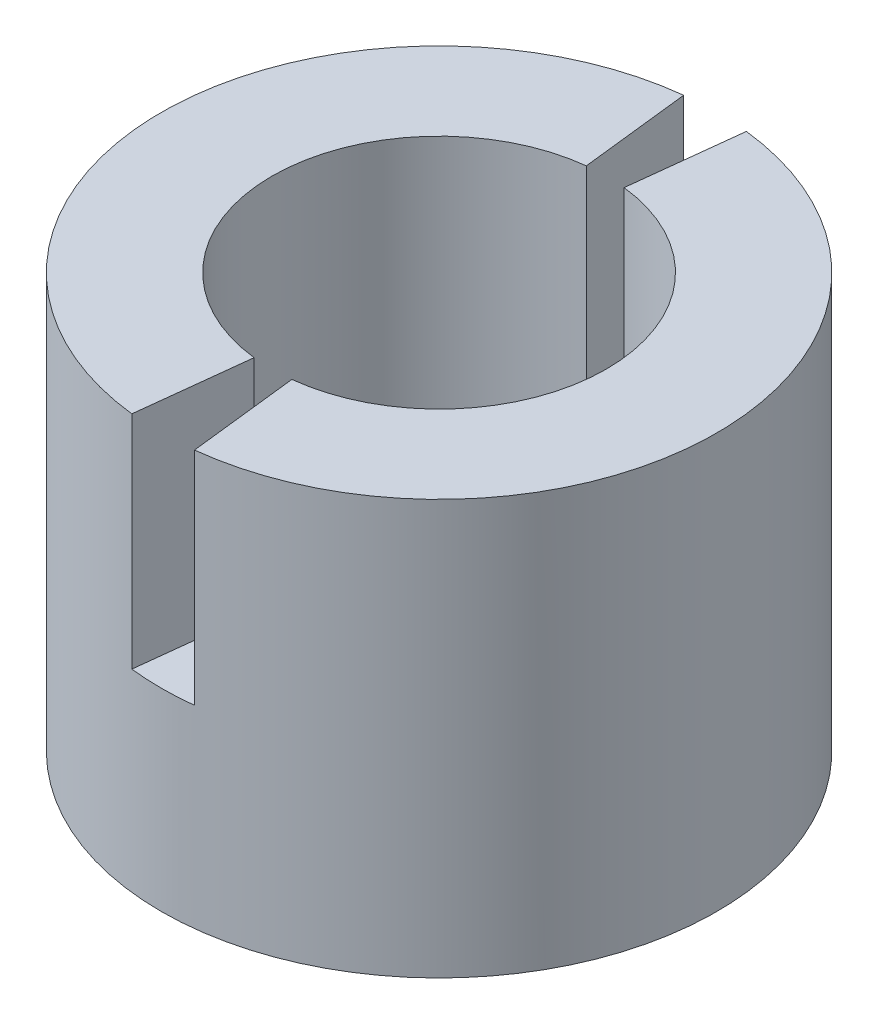
ISO-10303-21;
HEADER;
FILE_DESCRIPTION(('STEP AP214'),'2;1');
FILE_NAME('part.step','',(''),(''),'','','');
FILE_SCHEMA(('AUTOMOTIVE_DESIGN { 1 0 10303 214 1 1 1 1 }'));
ENDSEC;
DATA;
#1=APPLICATION_CONTEXT('core data for automotive mechanical design processes');
#2=APPLICATION_PROTOCOL_DEFINITION('international standard','automotive_design',2000,#1);
#3=PRODUCT_CONTEXT('',#1,'mechanical');
#4=PRODUCT('Part','Part','',(#3));
#5=PRODUCT_RELATED_PRODUCT_CATEGORY('part','',(#4));
#6=PRODUCT_DEFINITION_FORMATION('','',#4);
#7=PRODUCT_DEFINITION_CONTEXT('part definition',#1,'design');
#8=PRODUCT_DEFINITION('design','',#6,#7);
#9=PRODUCT_DEFINITION_SHAPE('','',#8);
#10=(LENGTH_UNIT() NAMED_UNIT(*) SI_UNIT(.MILLI.,.METRE.));
#11=(NAMED_UNIT(*) PLANE_ANGLE_UNIT() SI_UNIT($,.RADIAN.));
#12=(NAMED_UNIT(*) SI_UNIT($,.STERADIAN.) SOLID_ANGLE_UNIT());
#13=UNCERTAINTY_MEASURE_WITH_UNIT(LENGTH_MEASURE(1.E-05),#10,'distance_accuracy_value','');
#14=(GEOMETRIC_REPRESENTATION_CONTEXT(3) GLOBAL_UNCERTAINTY_ASSIGNED_CONTEXT((#13)) GLOBAL_UNIT_ASSIGNED_CONTEXT((#10,
#11,#12)) REPRESENTATION_CONTEXT('',''));
#15=CARTESIAN_POINT('',(0.,0.,0.));
#16=DIRECTION('',(0.,0.,1.));
#17=DIRECTION('',(1.,0.,0.));
#18=AXIS2_PLACEMENT_3D('',#15,#16,#17);
#19=CARTESIAN_POINT('',(0.,15.,0.));
#20=DIRECTION('',(0.,1.,0.));
#21=DIRECTION('',(0.,0.,1.));
#22=AXIS2_PLACEMENT_3D('',#19,#20,#21);
#23=PLANE('',#22);
#24=DIRECTION('',(0.112854640488553,0.,-0.99361150864923));
#25=VECTOR('',#24,1.);
#26=CARTESIAN_POINT('',(0.637272671467664,15.,-5.61077025966101));
#27=LINE('',#26,#25);
#28=CARTESIAN_POINT('',(0.682770574955748,15.,-6.01134962732784));
#29=VERTEX_POINT('',#28);
#30=CARTESIAN_POINT('',(1.13418913690996,15.,-9.98579566192476));
#31=VERTEX_POINT('',#30);
#32=EDGE_CURVE('E183',#29,#31,#27,.T.);
#33=ORIENTED_EDGE('',*,*,#32,.F.);
#34=CARTESIAN_POINT('',(0.,15.,0.));
#35=DIRECTION('',(0.,1.,0.));
#36=DIRECTION('',(0.,0.,1.));
#37=AXIS2_PLACEMENT_3D('',#34,#35,#36);
#38=CIRCLE('',#37,6.05);
#39=CARTESIAN_POINT('',(0.682770574955748,15.,6.01134962732784));
#40=VERTEX_POINT('',#39);
#41=EDGE_CURVE('E137',#40,#29,#38,.T.);
#42=ORIENTED_EDGE('',*,*,#41,.F.);
#43=DIRECTION('',(-0.112854640488553,0.,-0.99361150864923));
#44=VECTOR('',#43,1.);
#45=CARTESIAN_POINT('',(0.637272671467664,15.,5.61077025966101));
#46=LINE('',#45,#44);
#47=CARTESIAN_POINT('',(1.13418913690996,15.,9.98579566192476));
#48=VERTEX_POINT('',#47);
#49=EDGE_CURVE('E129',#48,#40,#46,.T.);
#50=ORIENTED_EDGE('',*,*,#49,.F.);
#51=CARTESIAN_POINT('',(0.,15.,0.));
#52=DIRECTION('',(0.,1.,0.));
#53=DIRECTION('',(0.,0.,1.));
#54=AXIS2_PLACEMENT_3D('',#51,#52,#53);
#55=CIRCLE('',#54,10.05);
#56=EDGE_CURVE('E150',#48,#31,#55,.T.);
#57=ORIENTED_EDGE('',*,*,#56,.T.);
#58=EDGE_LOOP('',(#33,#42,#50,#57));
#59=FACE_BOUND('',#58,.T.);
#60=ADVANCED_FACE('F41',(#59),#23,.T.);
#61=DIRECTION('',(0.112854640488553,0.,0.99361150864923));
#62=VECTOR('',#61,1.);
#63=CARTESIAN_POINT('',(-0.637272671467664,15.,-5.61077025966101));
#64=LINE('',#63,#62);
#65=CARTESIAN_POINT('',(-1.13418913690996,15.,-9.98579566192476));
#66=VERTEX_POINT('',#65);
#67=CARTESIAN_POINT('',(-0.682770574955748,15.,-6.01134962732784));
#68=VERTEX_POINT('',#67);
#69=EDGE_CURVE('E167',#66,#68,#64,.T.);
#70=ORIENTED_EDGE('',*,*,#69,.F.);
#71=CARTESIAN_POINT('',(-1.13418913690996,15.,9.98579566192476));
#72=VERTEX_POINT('',#71);
#73=EDGE_CURVE('E127',#66,#72,#55,.T.);
#74=ORIENTED_EDGE('',*,*,#73,.T.);
#75=DIRECTION('',(-0.112854640488553,0.,0.99361150864923));
#76=VECTOR('',#75,1.);
#77=CARTESIAN_POINT('',(-0.637272671467664,15.,5.61077025966101));
#78=LINE('',#77,#76);
#79=CARTESIAN_POINT('',(-0.682770574955748,15.,6.01134962732784));
#80=VERTEX_POINT('',#79);
#81=EDGE_CURVE('E109',#80,#72,#78,.T.);
#82=ORIENTED_EDGE('',*,*,#81,.F.);
#83=EDGE_CURVE('E125',#68,#80,#38,.T.);
#84=ORIENTED_EDGE('',*,*,#83,.F.);
#85=EDGE_LOOP('',(#70,#74,#82,#84));
#86=FACE_BOUND('',#85,.T.);
#87=ADVANCED_FACE('F124',(#86),#23,.T.);
#88=CARTESIAN_POINT('',(0.,0.,0.));
#89=DIRECTION('',(0.,1.,0.));
#90=DIRECTION('',(0.,0.,1.));
#91=AXIS2_PLACEMENT_3D('',#88,#89,#90);
#92=PLANE('',#91);
#93=CARTESIAN_POINT('',(0.,0.,0.));
#94=DIRECTION('',(0.,1.,0.));
#95=DIRECTION('',(0.,0.,1.));
#96=AXIS2_PLACEMENT_3D('',#93,#94,#95);
#97=CIRCLE('',#96,10.05);
#98=CARTESIAN_POINT('',(0.,0.,10.05));
#99=VERTEX_POINT('',#98);
#100=EDGE_CURVE('E143',#99,#99,#97,.T.);
#101=ORIENTED_EDGE('',*,*,#100,.F.);
#102=EDGE_LOOP('',(#101));
#103=FACE_BOUND('',#102,.T.);
#104=CARTESIAN_POINT('',(0.,0.,0.));
#105=DIRECTION('',(0.,1.,0.));
#106=DIRECTION('',(0.,0.,1.));
#107=AXIS2_PLACEMENT_3D('',#104,#105,#106);
#108=CIRCLE('',#107,6.05);
#109=CARTESIAN_POINT('',(0.,0.,6.05));
#110=VERTEX_POINT('',#109);
#111=EDGE_CURVE('E138',#110,#110,#108,.T.);
#112=ORIENTED_EDGE('',*,*,#111,.T.);
#113=EDGE_LOOP('',(#112));
#114=FACE_BOUND('',#113,.T.);
#115=ADVANCED_FACE('F234',(#103,#114),#92,.F.);
#116=CARTESIAN_POINT('',(0.,15.,0.));
#117=DIRECTION('',(0.,-1.,0.));
#118=DIRECTION('',(0.,0.,-1.));
#119=AXIS2_PLACEMENT_3D('',#116,#117,#118);
#120=CYLINDRICAL_SURFACE('',#119,10.05);
#121=CARTESIAN_POINT('',(0.,7.,0.));
#122=DIRECTION('',(0.,1.,0.));
#123=DIRECTION('',(0.,0.,1.));
#124=AXIS2_PLACEMENT_3D('',#121,#122,#123);
#125=CIRCLE('',#124,10.05);
#126=CARTESIAN_POINT('',(1.13418913690996,7.,-9.98579566192476));
#127=VERTEX_POINT('',#126);
#128=CARTESIAN_POINT('',(-1.13418913690996,7.,-9.98579566192476));
#129=VERTEX_POINT('',#128);
#130=EDGE_CURVE('E204',#127,#129,#125,.T.);
#131=ORIENTED_EDGE('',*,*,#130,.F.);
#132=DIRECTION('',(0.,-1.,0.));
#133=VECTOR('',#132,1.);
#134=CARTESIAN_POINT('',(1.13418913690996,15.,-9.98579566192476));
#135=LINE('',#134,#133);
#136=EDGE_CURVE('E145',#127,#31,#135,.F.);
#137=ORIENTED_EDGE('',*,*,#136,.T.);
#138=ORIENTED_EDGE('',*,*,#56,.F.);
#139=DIRECTION('',(0.,-1.,0.));
#140=VECTOR('',#139,1.);
#141=CARTESIAN_POINT('',(1.13418913690996,15.,9.98579566192476));
#142=LINE('',#141,#140);
#143=CARTESIAN_POINT('',(1.13418913690996,7.,9.98579566192476));
#144=VERTEX_POINT('',#143);
#145=EDGE_CURVE('E200',#48,#144,#142,.T.);
#146=ORIENTED_EDGE('',*,*,#145,.T.);
#147=CARTESIAN_POINT('',(0.,7.,0.));
#148=DIRECTION('',(0.,-1.,0.));
#149=DIRECTION('',(0.,0.,-1.));
#150=AXIS2_PLACEMENT_3D('',#147,#148,#149);
#151=CIRCLE('',#150,10.05);
#152=CARTESIAN_POINT('',(-1.13418913690996,7.,9.98579566192476));
#153=VERTEX_POINT('',#152);
#154=EDGE_CURVE('E181',#144,#153,#151,.T.);
#155=ORIENTED_EDGE('',*,*,#154,.T.);
#156=DIRECTION('',(0.,-1.,0.));
#157=VECTOR('',#156,1.);
#158=CARTESIAN_POINT('',(-1.13418913690996,15.,9.98579566192476));
#159=LINE('',#158,#157);
#160=EDGE_CURVE('E197',#153,#72,#159,.F.);
#161=ORIENTED_EDGE('',*,*,#160,.T.);
#162=ORIENTED_EDGE('',*,*,#73,.F.);
#163=DIRECTION('',(0.,-1.,0.));
#164=VECTOR('',#163,1.);
#165=CARTESIAN_POINT('',(-1.13418913690996,15.,-9.98579566192476));
#166=LINE('',#165,#164);
#167=EDGE_CURVE('E206',#66,#129,#166,.T.);
#168=ORIENTED_EDGE('',*,*,#167,.T.);
#169=EDGE_LOOP('',(#131,#137,#138,#146,#155,#161,#162,#168));
#170=FACE_BOUND('',#169,.T.);
#171=ORIENTED_EDGE('',*,*,#100,.T.);
#172=EDGE_LOOP('',(#171));
#173=FACE_BOUND('',#172,.T.);
#174=ADVANCED_FACE('F43',(#170,#173),#120,.T.);
#175=CARTESIAN_POINT('',(0.,15.,0.));
#176=DIRECTION('',(0.,-1.,0.));
#177=DIRECTION('',(0.,0.,-1.));
#178=AXIS2_PLACEMENT_3D('',#175,#176,#177);
#179=CYLINDRICAL_SURFACE('',#178,6.05);
#180=DIRECTION('',(0.,-1.,0.));
#181=VECTOR('',#180,1.);
#182=CARTESIAN_POINT('',(0.682770574955748,15.,-6.01134962732784));
#183=LINE('',#182,#181);
#184=CARTESIAN_POINT('',(0.682770574955748,7.,-6.01134962732784));
#185=VERTEX_POINT('',#184);
#186=EDGE_CURVE('E11',#185,#29,#183,.F.);
#187=ORIENTED_EDGE('',*,*,#186,.F.);
#188=CARTESIAN_POINT('',(0.,7.,0.));
#189=DIRECTION('',(0.,1.,0.));
#190=DIRECTION('',(0.,0.,1.));
#191=AXIS2_PLACEMENT_3D('',#188,#189,#190);
#192=CIRCLE('',#191,6.05);
#193=CARTESIAN_POINT('',(-0.682770574955748,7.,-6.01134962732784));
#194=VERTEX_POINT('',#193);
#195=EDGE_CURVE('E161',#185,#194,#192,.T.);
#196=ORIENTED_EDGE('',*,*,#195,.T.);
#197=DIRECTION('',(0.,-1.,0.));
#198=VECTOR('',#197,1.);
#199=CARTESIAN_POINT('',(-0.682770574955748,15.,-6.01134962732784));
#200=LINE('',#199,#198);
#201=EDGE_CURVE('E50',#68,#194,#200,.T.);
#202=ORIENTED_EDGE('',*,*,#201,.F.);
#203=ORIENTED_EDGE('',*,*,#83,.T.);
#204=DIRECTION('',(0.,-1.,0.));
#205=VECTOR('',#204,1.);
#206=CARTESIAN_POINT('',(-0.682770574955748,15.,6.01134962732784));
#207=LINE('',#206,#205);
#208=CARTESIAN_POINT('',(-0.682770574955748,7.,6.01134962732784));
#209=VERTEX_POINT('',#208);
#210=EDGE_CURVE('E106',#209,#80,#207,.F.);
#211=ORIENTED_EDGE('',*,*,#210,.F.);
#212=CARTESIAN_POINT('',(0.,7.,0.));
#213=DIRECTION('',(0.,-1.,0.));
#214=DIRECTION('',(0.,0.,-1.));
#215=AXIS2_PLACEMENT_3D('',#212,#213,#214);
#216=CIRCLE('',#215,6.05);
#217=CARTESIAN_POINT('',(0.682770574955748,7.,6.01134962732784));
#218=VERTEX_POINT('',#217);
#219=EDGE_CURVE('E118',#218,#209,#216,.T.);
#220=ORIENTED_EDGE('',*,*,#219,.F.);
#221=DIRECTION('',(0.,-1.,0.));
#222=VECTOR('',#221,1.);
#223=CARTESIAN_POINT('',(0.682770574955748,15.,6.01134962732784));
#224=LINE('',#223,#222);
#225=EDGE_CURVE('E117',#40,#218,#224,.T.);
#226=ORIENTED_EDGE('',*,*,#225,.F.);
#227=ORIENTED_EDGE('',*,*,#41,.T.);
#228=EDGE_LOOP('',(#187,#196,#202,#203,#211,#220,#226,#227));
#229=FACE_BOUND('',#228,.T.);
#230=ORIENTED_EDGE('',*,*,#111,.F.);
#231=EDGE_LOOP('',(#230));
#232=FACE_BOUND('',#231,.T.);
#233=ADVANCED_FACE('F133',(#229,#232),#179,.F.);
#234=CARTESIAN_POINT('',(0.637272671467664,7.,5.61077025966101));
#235=DIRECTION('',(0.99361150864923,0.,-0.112854640488553));
#236=DIRECTION('',(-0.112854640488553,0.,-0.99361150864923));
#237=AXIS2_PLACEMENT_3D('',#234,#235,#236);
#238=PLANE('',#237);
#239=ORIENTED_EDGE('',*,*,#49,.T.);
#240=ORIENTED_EDGE('',*,*,#225,.T.);
#241=DIRECTION('',(-0.112854640488553,0.,-0.99361150864923));
#242=VECTOR('',#241,1.);
#243=CARTESIAN_POINT('',(0.637272671467664,7.,5.61077025966101));
#244=LINE('',#243,#242);
#245=EDGE_CURVE('E65',#144,#218,#244,.T.);
#246=ORIENTED_EDGE('',*,*,#245,.F.);
#247=ORIENTED_EDGE('',*,*,#145,.F.);
#248=EDGE_LOOP('',(#239,#240,#246,#247));
#249=FACE_BOUND('',#248,.T.);
#250=ADVANCED_FACE('F217',(#249),#238,.F.);
#251=CARTESIAN_POINT('',(-0.637272671467664,7.,5.61077025966101));
#252=DIRECTION('',(-0.99361150864923,0.,-0.112854640488553));
#253=DIRECTION('',(-0.112854640488553,0.,0.99361150864923));
#254=AXIS2_PLACEMENT_3D('',#251,#252,#253);
#255=PLANE('',#254);
#256=DIRECTION('',(-0.112854640488553,0.,0.99361150864923));
#257=VECTOR('',#256,1.);
#258=CARTESIAN_POINT('',(-0.637272671467664,7.,5.61077025966101));
#259=LINE('',#258,#257);
#260=EDGE_CURVE('E112',#209,#153,#259,.T.);
#261=ORIENTED_EDGE('',*,*,#260,.F.);
#262=ORIENTED_EDGE('',*,*,#210,.T.);
#263=ORIENTED_EDGE('',*,*,#81,.T.);
#264=ORIENTED_EDGE('',*,*,#160,.F.);
#265=EDGE_LOOP('',(#261,#262,#263,#264));
#266=FACE_BOUND('',#265,.T.);
#267=ADVANCED_FACE('F108',(#266),#255,.F.);
#268=CARTESIAN_POINT('',(0.,7.,0.));
#269=DIRECTION('',(0.,-1.,0.));
#270=DIRECTION('',(0.,0.,-1.));
#271=AXIS2_PLACEMENT_3D('',#268,#269,#270);
#272=PLANE('',#271);
#273=ORIENTED_EDGE('',*,*,#245,.T.);
#274=ORIENTED_EDGE('',*,*,#219,.T.);
#275=ORIENTED_EDGE('',*,*,#260,.T.);
#276=ORIENTED_EDGE('',*,*,#154,.F.);
#277=EDGE_LOOP('',(#273,#274,#275,#276));
#278=FACE_BOUND('',#277,.T.);
#279=ADVANCED_FACE('F218',(#278),#272,.F.);
#280=CARTESIAN_POINT('',(0.637272671467664,7.,-5.61077025966101));
#281=DIRECTION('',(0.99361150864923,0.,0.112854640488553));
#282=DIRECTION('',(0.112854640488553,0.,-0.99361150864923));
#283=AXIS2_PLACEMENT_3D('',#280,#281,#282);
#284=PLANE('',#283);
#285=DIRECTION('',(0.112854640488553,0.,-0.99361150864923));
#286=VECTOR('',#285,1.);
#287=CARTESIAN_POINT('',(0.637272671467664,7.,-5.61077025966101));
#288=LINE('',#287,#286);
#289=EDGE_CURVE('E171',#185,#127,#288,.T.);
#290=ORIENTED_EDGE('',*,*,#289,.F.);
#291=ORIENTED_EDGE('',*,*,#186,.T.);
#292=ORIENTED_EDGE('',*,*,#32,.T.);
#293=ORIENTED_EDGE('',*,*,#136,.F.);
#294=EDGE_LOOP('',(#290,#291,#292,#293));
#295=FACE_BOUND('',#294,.T.);
#296=ADVANCED_FACE('F174',(#295),#284,.F.);
#297=CARTESIAN_POINT('',(-0.637272671467664,7.,-5.61077025966101));
#298=DIRECTION('',(-0.99361150864923,0.,0.112854640488553));
#299=DIRECTION('',(0.112854640488553,0.,0.99361150864923));
#300=AXIS2_PLACEMENT_3D('',#297,#298,#299);
#301=PLANE('',#300);
#302=ORIENTED_EDGE('',*,*,#69,.T.);
#303=ORIENTED_EDGE('',*,*,#201,.T.);
#304=DIRECTION('',(0.112854640488553,0.,0.99361150864923));
#305=VECTOR('',#304,1.);
#306=CARTESIAN_POINT('',(-0.637272671467664,7.,-5.61077025966101));
#307=LINE('',#306,#305);
#308=EDGE_CURVE('E57',#129,#194,#307,.T.);
#309=ORIENTED_EDGE('',*,*,#308,.F.);
#310=ORIENTED_EDGE('',*,*,#167,.F.);
#311=EDGE_LOOP('',(#302,#303,#309,#310));
#312=FACE_BOUND('',#311,.T.);
#313=ADVANCED_FACE('F165',(#312),#301,.F.);
#314=CARTESIAN_POINT('',(0.,7.,0.));
#315=DIRECTION('',(0.,1.,0.));
#316=DIRECTION('',(0.,0.,1.));
#317=AXIS2_PLACEMENT_3D('',#314,#315,#316);
#318=PLANE('',#317);
#319=ORIENTED_EDGE('',*,*,#130,.T.);
#320=ORIENTED_EDGE('',*,*,#308,.T.);
#321=ORIENTED_EDGE('',*,*,#195,.F.);
#322=ORIENTED_EDGE('',*,*,#289,.T.);
#323=EDGE_LOOP('',(#319,#320,#321,#322));
#324=FACE_BOUND('',#323,.T.);
#325=ADVANCED_FACE('F170',(#324),#318,.T.);
#326=CLOSED_SHELL('',(#60,#87,#115,#174,#233,#250,#267,#279,#296,#313,#325));
#327=MANIFOLD_SOLID_BREP('B2',#326);
#328=ADVANCED_BREP_SHAPE_REPRESENTATION('',(#18,#327),#14);
#329=SHAPE_DEFINITION_REPRESENTATION(#9,#328);
ENDSEC;
END-ISO-10303-21;
